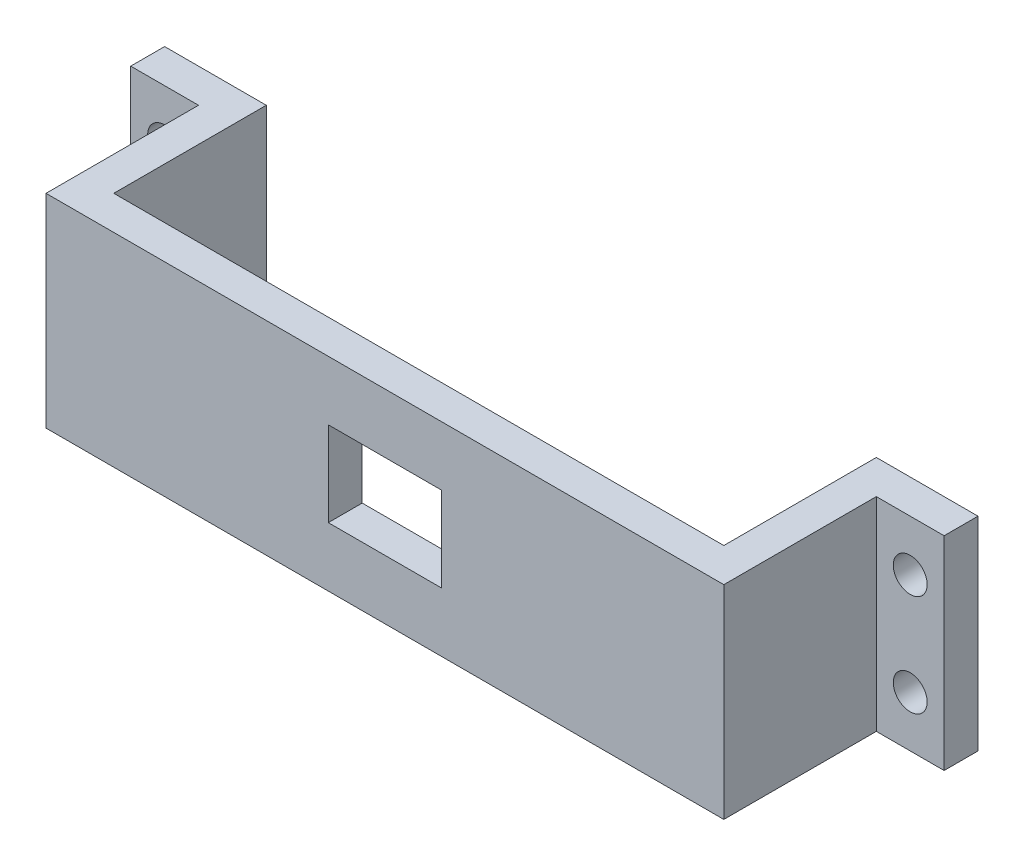
ISO-10303-21;
HEADER;
FILE_DESCRIPTION(('STEP AP214'),'2;1');
FILE_NAME('part.step','',(''),(''),'','','');
FILE_SCHEMA(('AUTOMOTIVE_DESIGN { 1 0 10303 214 1 1 1 1 }'));
ENDSEC;
DATA;
#1=APPLICATION_CONTEXT('core data for automotive mechanical design processes');
#2=APPLICATION_PROTOCOL_DEFINITION('international standard','automotive_design',2000,#1);
#3=PRODUCT_CONTEXT('',#1,'mechanical');
#4=PRODUCT('Part','Part','',(#3));
#5=PRODUCT_RELATED_PRODUCT_CATEGORY('part','',(#4));
#6=PRODUCT_DEFINITION_FORMATION('','',#4);
#7=PRODUCT_DEFINITION_CONTEXT('part definition',#1,'design');
#8=PRODUCT_DEFINITION('design','',#6,#7);
#9=PRODUCT_DEFINITION_SHAPE('','',#8);
#10=(LENGTH_UNIT() NAMED_UNIT(*) SI_UNIT(.MILLI.,.METRE.));
#11=(NAMED_UNIT(*) PLANE_ANGLE_UNIT() SI_UNIT($,.RADIAN.));
#12=(NAMED_UNIT(*) SI_UNIT($,.STERADIAN.) SOLID_ANGLE_UNIT());
#13=UNCERTAINTY_MEASURE_WITH_UNIT(LENGTH_MEASURE(1.E-05),#10,'distance_accuracy_value','');
#14=(GEOMETRIC_REPRESENTATION_CONTEXT(3) GLOBAL_UNCERTAINTY_ASSIGNED_CONTEXT((#13)) GLOBAL_UNIT_ASSIGNED_CONTEXT((#10,
#11,#12)) REPRESENTATION_CONTEXT('',''));
#15=CARTESIAN_POINT('',(0.,0.,0.));
#16=DIRECTION('',(0.,0.,1.));
#17=DIRECTION('',(1.,0.,0.));
#18=AXIS2_PLACEMENT_3D('',#15,#16,#17);
#19=CARTESIAN_POINT('',(0.,0.,6.35));
#20=DIRECTION('',(1.,0.,0.));
#21=DIRECTION('',(0.,0.,-1.));
#22=AXIS2_PLACEMENT_3D('',#19,#20,#21);
#23=PLANE('',#22);
#24=DIRECTION('',(0.,1.,0.));
#25=VECTOR('',#24,1.);
#26=CARTESIAN_POINT('',(0.,38.1,-22.225));
#27=LINE('',#26,#25);
#28=CARTESIAN_POINT('',(0.,0.,-22.225));
#29=VERTEX_POINT('',#28);
#30=CARTESIAN_POINT('',(0.,38.1,-22.225));
#31=VERTEX_POINT('',#30);
#32=EDGE_CURVE('E54',#29,#31,#27,.T.);
#33=ORIENTED_EDGE('',*,*,#32,.F.);
#34=DIRECTION('',(0.,0.,-1.));
#35=VECTOR('',#34,1.);
#36=CARTESIAN_POINT('',(0.,0.,6.35));
#37=LINE('',#36,#35);
#38=CARTESIAN_POINT('',(0.,0.,6.35));
#39=VERTEX_POINT('',#38);
#40=EDGE_CURVE('E11',#39,#29,#37,.T.);
#41=ORIENTED_EDGE('',*,*,#40,.F.);
#42=DIRECTION('',(0.,-1.,0.));
#43=VECTOR('',#42,1.);
#44=CARTESIAN_POINT('',(0.,0.,6.35));
#45=LINE('',#44,#43);
#46=CARTESIAN_POINT('',(0.,38.1,6.35));
#47=VERTEX_POINT('',#46);
#48=EDGE_CURVE('E300',#47,#39,#45,.T.);
#49=ORIENTED_EDGE('',*,*,#48,.F.);
#50=DIRECTION('',(0.,0.,-1.));
#51=VECTOR('',#50,1.);
#52=CARTESIAN_POINT('',(0.,38.1,6.35));
#53=LINE('',#52,#51);
#54=EDGE_CURVE('E314',#47,#31,#53,.T.);
#55=ORIENTED_EDGE('',*,*,#54,.T.);
#56=EDGE_LOOP('',(#33,#41,#49,#55));
#57=FACE_BOUND('',#56,.T.);
#58=ADVANCED_FACE('F39',(#57),#23,.F.);
#59=CARTESIAN_POINT('',(127.,0.,6.35));
#60=DIRECTION('',(-1.,0.,0.));
#61=DIRECTION('',(0.,0.,1.));
#62=AXIS2_PLACEMENT_3D('',#59,#60,#61);
#63=PLANE('',#62);
#64=DIRECTION('',(0.,-1.,0.));
#65=VECTOR('',#64,1.);
#66=CARTESIAN_POINT('',(127.,0.,-22.225));
#67=LINE('',#66,#65);
#68=CARTESIAN_POINT('',(127.,38.1,-22.225));
#69=VERTEX_POINT('',#68);
#70=CARTESIAN_POINT('',(127.,0.,-22.225));
#71=VERTEX_POINT('',#70);
#72=EDGE_CURVE('E61',#69,#71,#67,.T.);
#73=ORIENTED_EDGE('',*,*,#72,.F.);
#74=DIRECTION('',(0.,0.,-1.));
#75=VECTOR('',#74,1.);
#76=CARTESIAN_POINT('',(127.,38.1,6.35));
#77=LINE('',#76,#75);
#78=CARTESIAN_POINT('',(127.,38.1,6.35));
#79=VERTEX_POINT('',#78);
#80=EDGE_CURVE('E322',#79,#69,#77,.T.);
#81=ORIENTED_EDGE('',*,*,#80,.F.);
#82=DIRECTION('',(0.,1.,0.));
#83=VECTOR('',#82,1.);
#84=CARTESIAN_POINT('',(127.,0.,6.35));
#85=LINE('',#84,#83);
#86=CARTESIAN_POINT('',(127.,0.,6.35));
#87=VERTEX_POINT('',#86);
#88=EDGE_CURVE('E308',#87,#79,#85,.T.);
#89=ORIENTED_EDGE('',*,*,#88,.F.);
#90=DIRECTION('',(0.,0.,-1.));
#91=VECTOR('',#90,1.);
#92=CARTESIAN_POINT('',(127.,0.,6.35));
#93=LINE('',#92,#91);
#94=EDGE_CURVE('E47',#87,#71,#93,.T.);
#95=ORIENTED_EDGE('',*,*,#94,.T.);
#96=EDGE_LOOP('',(#73,#81,#89,#95));
#97=FACE_BOUND('',#96,.T.);
#98=ADVANCED_FACE('F327',(#97),#63,.F.);
#99=CARTESIAN_POINT('',(0.,0.,0.));
#100=DIRECTION('',(0.,0.,-1.));
#101=DIRECTION('',(-1.,0.,0.));
#102=AXIS2_PLACEMENT_3D('',#99,#100,#101);
#103=PLANE('',#102);
#104=DIRECTION('',(-1.,0.,0.));
#105=VECTOR('',#104,1.);
#106=CARTESIAN_POINT('',(52.8955,26.99004,0.));
#107=LINE('',#106,#105);
#108=CARTESIAN_POINT('',(74.1045,26.99004,0.));
#109=VERTEX_POINT('',#108);
#110=CARTESIAN_POINT('',(52.8955,26.99004,0.));
#111=VERTEX_POINT('',#110);
#112=EDGE_CURVE('E261',#109,#111,#107,.T.);
#113=ORIENTED_EDGE('',*,*,#112,.T.);
#114=DIRECTION('',(0.,-1.,0.));
#115=VECTOR('',#114,1.);
#116=CARTESIAN_POINT('',(52.8955,11.10996,0.));
#117=LINE('',#116,#115);
#118=CARTESIAN_POINT('',(52.8955,11.10996,0.));
#119=VERTEX_POINT('',#118);
#120=EDGE_CURVE('E256',#111,#119,#117,.T.);
#121=ORIENTED_EDGE('',*,*,#120,.T.);
#122=DIRECTION('',(1.,0.,0.));
#123=VECTOR('',#122,1.);
#124=CARTESIAN_POINT('',(52.8955,11.10996,0.));
#125=LINE('',#124,#123);
#126=CARTESIAN_POINT('',(74.1045,11.10996,0.));
#127=VERTEX_POINT('',#126);
#128=EDGE_CURVE('E275',#119,#127,#125,.T.);
#129=ORIENTED_EDGE('',*,*,#128,.T.);
#130=DIRECTION('',(0.,1.,0.));
#131=VECTOR('',#130,1.);
#132=CARTESIAN_POINT('',(74.1045,11.10996,0.));
#133=LINE('',#132,#131);
#134=EDGE_CURVE('E279',#127,#109,#133,.T.);
#135=ORIENTED_EDGE('',*,*,#134,.T.);
#136=EDGE_LOOP('',(#113,#121,#129,#135));
#137=FACE_BOUND('',#136,.T.);
#138=DIRECTION('',(-1.,0.,0.));
#139=VECTOR('',#138,1.);
#140=CARTESIAN_POINT('',(0.,38.1,0.));
#141=LINE('',#140,#139);
#142=CARTESIAN_POINT('',(120.65,38.1,0.));
#143=VERTEX_POINT('',#142);
#144=CARTESIAN_POINT('',(6.35,38.1,0.));
#145=VERTEX_POINT('',#144);
#146=EDGE_CURVE('E305',#143,#145,#141,.T.);
#147=ORIENTED_EDGE('',*,*,#146,.F.);
#148=DIRECTION('',(0.,1.,0.));
#149=VECTOR('',#148,1.);
#150=CARTESIAN_POINT('',(120.65,0.,0.));
#151=LINE('',#150,#149);
#152=CARTESIAN_POINT('',(120.65,0.,0.));
#153=VERTEX_POINT('',#152);
#154=EDGE_CURVE('E222',#153,#143,#151,.T.);
#155=ORIENTED_EDGE('',*,*,#154,.F.);
#156=DIRECTION('',(1.,0.,0.));
#157=VECTOR('',#156,1.);
#158=CARTESIAN_POINT('',(0.,0.,0.));
#159=LINE('',#158,#157);
#160=CARTESIAN_POINT('',(6.35,0.,0.));
#161=VERTEX_POINT('',#160);
#162=EDGE_CURVE('E299',#161,#153,#159,.T.);
#163=ORIENTED_EDGE('',*,*,#162,.F.);
#164=DIRECTION('',(0.,-1.,0.));
#165=VECTOR('',#164,1.);
#166=CARTESIAN_POINT('',(6.35,0.,0.));
#167=LINE('',#166,#165);
#168=EDGE_CURVE('E241',#145,#161,#167,.T.);
#169=ORIENTED_EDGE('',*,*,#168,.F.);
#170=EDGE_LOOP('',(#147,#155,#163,#169));
#171=FACE_BOUND('',#170,.T.);
#172=ADVANCED_FACE('F362',(#137,#171),#103,.T.);
#173=CARTESIAN_POINT('',(0.,0.,6.35));
#174=DIRECTION('',(0.,0.,-1.));
#175=DIRECTION('',(-1.,0.,0.));
#176=AXIS2_PLACEMENT_3D('',#173,#174,#175);
#177=PLANE('',#176);
#178=ORIENTED_EDGE('',*,*,#48,.T.);
#179=DIRECTION('',(1.,0.,0.));
#180=VECTOR('',#179,1.);
#181=CARTESIAN_POINT('',(0.,0.,6.35));
#182=LINE('',#181,#180);
#183=EDGE_CURVE('E304',#39,#87,#182,.T.);
#184=ORIENTED_EDGE('',*,*,#183,.T.);
#185=ORIENTED_EDGE('',*,*,#88,.T.);
#186=DIRECTION('',(-1.,0.,0.));
#187=VECTOR('',#186,1.);
#188=CARTESIAN_POINT('',(0.,38.1,6.35));
#189=LINE('',#188,#187);
#190=EDGE_CURVE('E311',#79,#47,#189,.T.);
#191=ORIENTED_EDGE('',*,*,#190,.T.);
#192=EDGE_LOOP('',(#178,#184,#185,#191));
#193=FACE_BOUND('',#192,.T.);
#194=DIRECTION('',(0.,-1.,0.));
#195=VECTOR('',#194,1.);
#196=CARTESIAN_POINT('',(52.8955,11.10996,6.35));
#197=LINE('',#196,#195);
#198=CARTESIAN_POINT('',(52.8955,26.99004,6.35));
#199=VERTEX_POINT('',#198);
#200=CARTESIAN_POINT('',(52.8955,11.10996,6.35));
#201=VERTEX_POINT('',#200);
#202=EDGE_CURVE('E257',#199,#201,#197,.T.);
#203=ORIENTED_EDGE('',*,*,#202,.F.);
#204=DIRECTION('',(-1.,0.,0.));
#205=VECTOR('',#204,1.);
#206=CARTESIAN_POINT('',(52.8955,26.99004,6.35));
#207=LINE('',#206,#205);
#208=CARTESIAN_POINT('',(74.1045,26.99004,6.35));
#209=VERTEX_POINT('',#208);
#210=EDGE_CURVE('E268',#209,#199,#207,.T.);
#211=ORIENTED_EDGE('',*,*,#210,.F.);
#212=DIRECTION('',(0.,1.,0.));
#213=VECTOR('',#212,1.);
#214=CARTESIAN_POINT('',(74.1045,11.10996,6.35));
#215=LINE('',#214,#213);
#216=CARTESIAN_POINT('',(74.1045,11.10996,6.35));
#217=VERTEX_POINT('',#216);
#218=EDGE_CURVE('E264',#217,#209,#215,.T.);
#219=ORIENTED_EDGE('',*,*,#218,.F.);
#220=DIRECTION('',(1.,0.,0.));
#221=VECTOR('',#220,1.);
#222=CARTESIAN_POINT('',(52.8955,11.10996,6.35));
#223=LINE('',#222,#221);
#224=EDGE_CURVE('E260',#201,#217,#223,.T.);
#225=ORIENTED_EDGE('',*,*,#224,.F.);
#226=EDGE_LOOP('',(#203,#211,#219,#225));
#227=FACE_BOUND('',#226,.T.);
#228=ADVANCED_FACE('F350',(#193,#227),#177,.F.);
#229=CARTESIAN_POINT('',(0.,0.,6.35));
#230=DIRECTION('',(0.,1.,0.));
#231=DIRECTION('',(0.,0.,1.));
#232=AXIS2_PLACEMENT_3D('',#229,#230,#231);
#233=PLANE('',#232);
#234=ORIENTED_EDGE('',*,*,#40,.T.);
#235=DIRECTION('',(1.,0.,0.));
#236=VECTOR('',#235,1.);
#237=CARTESIAN_POINT('',(-12.7,0.,-22.225));
#238=LINE('',#237,#236);
#239=CARTESIAN_POINT('',(-12.7,0.,-22.225));
#240=VERTEX_POINT('',#239);
#241=EDGE_CURVE('E170',#240,#29,#238,.T.);
#242=ORIENTED_EDGE('',*,*,#241,.F.);
#243=DIRECTION('',(0.,0.,1.));
#244=VECTOR('',#243,1.);
#245=CARTESIAN_POINT('',(-12.7,0.,-28.575));
#246=LINE('',#245,#244);
#247=CARTESIAN_POINT('',(-12.7,0.,-28.575));
#248=VERTEX_POINT('',#247);
#249=EDGE_CURVE('E167',#248,#240,#246,.T.);
#250=ORIENTED_EDGE('',*,*,#249,.F.);
#251=DIRECTION('',(-1.,0.,0.));
#252=VECTOR('',#251,1.);
#253=CARTESIAN_POINT('',(0.,0.,-28.575));
#254=LINE('',#253,#252);
#255=CARTESIAN_POINT('',(6.35,0.,-28.575));
#256=VERTEX_POINT('',#255);
#257=EDGE_CURVE('E153',#256,#248,#254,.T.);
#258=ORIENTED_EDGE('',*,*,#257,.F.);
#259=DIRECTION('',(0.,0.,1.));
#260=VECTOR('',#259,1.);
#261=CARTESIAN_POINT('',(6.35,0.,-28.575));
#262=LINE('',#261,#260);
#263=EDGE_CURVE('E164',#256,#161,#262,.T.);
#264=ORIENTED_EDGE('',*,*,#263,.T.);
#265=ORIENTED_EDGE('',*,*,#162,.T.);
#266=DIRECTION('',(0.,0.,1.));
#267=VECTOR('',#266,1.);
#268=CARTESIAN_POINT('',(120.65,0.,-28.575));
#269=LINE('',#268,#267);
#270=CARTESIAN_POINT('',(120.65,0.,-28.575));
#271=VERTEX_POINT('',#270);
#272=EDGE_CURVE('E238',#271,#153,#269,.T.);
#273=ORIENTED_EDGE('',*,*,#272,.F.);
#274=DIRECTION('',(-1.,0.,0.));
#275=VECTOR('',#274,1.);
#276=CARTESIAN_POINT('',(127.,0.,-28.575));
#277=LINE('',#276,#275);
#278=CARTESIAN_POINT('',(139.7,0.,-28.575));
#279=VERTEX_POINT('',#278);
#280=EDGE_CURVE('E223',#279,#271,#277,.T.);
#281=ORIENTED_EDGE('',*,*,#280,.F.);
#282=DIRECTION('',(0.,0.,-1.));
#283=VECTOR('',#282,1.);
#284=CARTESIAN_POINT('',(139.7,0.,-28.575));
#285=LINE('',#284,#283);
#286=CARTESIAN_POINT('',(139.7,0.,-22.225));
#287=VERTEX_POINT('',#286);
#288=EDGE_CURVE('E208',#287,#279,#285,.T.);
#289=ORIENTED_EDGE('',*,*,#288,.F.);
#290=DIRECTION('',(-1.,0.,0.));
#291=VECTOR('',#290,1.);
#292=CARTESIAN_POINT('',(139.7,0.,-22.225));
#293=LINE('',#292,#291);
#294=EDGE_CURVE('E212',#287,#71,#293,.T.);
#295=ORIENTED_EDGE('',*,*,#294,.T.);
#296=ORIENTED_EDGE('',*,*,#94,.F.);
#297=ORIENTED_EDGE('',*,*,#183,.F.);
#298=EDGE_LOOP('',(#234,#242,#250,#258,#264,#265,#273,#281,#289,#295,#296,#297));
#299=FACE_BOUND('',#298,.T.);
#300=ADVANCED_FACE('F168',(#299),#233,.F.);
#301=CARTESIAN_POINT('',(0.,38.1,6.35));
#302=DIRECTION('',(0.,-1.,0.));
#303=DIRECTION('',(0.,0.,-1.));
#304=AXIS2_PLACEMENT_3D('',#301,#302,#303);
#305=PLANE('',#304);
#306=ORIENTED_EDGE('',*,*,#80,.T.);
#307=DIRECTION('',(-1.,0.,0.));
#308=VECTOR('',#307,1.);
#309=CARTESIAN_POINT('',(139.7,38.1,-22.225));
#310=LINE('',#309,#308);
#311=CARTESIAN_POINT('',(139.7,38.1,-22.225));
#312=VERTEX_POINT('',#311);
#313=EDGE_CURVE('E218',#312,#69,#310,.T.);
#314=ORIENTED_EDGE('',*,*,#313,.F.);
#315=DIRECTION('',(0.,0.,1.));
#316=VECTOR('',#315,1.);
#317=CARTESIAN_POINT('',(139.7,38.1,-28.575));
#318=LINE('',#317,#316);
#319=CARTESIAN_POINT('',(139.7,38.1,-28.575));
#320=VERTEX_POINT('',#319);
#321=EDGE_CURVE('E202',#320,#312,#318,.T.);
#322=ORIENTED_EDGE('',*,*,#321,.F.);
#323=DIRECTION('',(1.,0.,0.));
#324=VECTOR('',#323,1.);
#325=CARTESIAN_POINT('',(127.,38.1,-28.575));
#326=LINE('',#325,#324);
#327=CARTESIAN_POINT('',(120.65,38.1,-28.575));
#328=VERTEX_POINT('',#327);
#329=EDGE_CURVE('E229',#328,#320,#326,.T.);
#330=ORIENTED_EDGE('',*,*,#329,.F.);
#331=DIRECTION('',(0.,0.,1.));
#332=VECTOR('',#331,1.);
#333=CARTESIAN_POINT('',(120.65,38.1,-28.575));
#334=LINE('',#333,#332);
#335=EDGE_CURVE('E232',#328,#143,#334,.T.);
#336=ORIENTED_EDGE('',*,*,#335,.T.);
#337=ORIENTED_EDGE('',*,*,#146,.T.);
#338=DIRECTION('',(0.,0.,1.));
#339=VECTOR('',#338,1.);
#340=CARTESIAN_POINT('',(6.34999999999999,38.1,-28.575));
#341=LINE('',#340,#339);
#342=CARTESIAN_POINT('',(6.34999999999999,38.1,-28.575));
#343=VERTEX_POINT('',#342);
#344=EDGE_CURVE('E252',#343,#145,#341,.T.);
#345=ORIENTED_EDGE('',*,*,#344,.F.);
#346=DIRECTION('',(1.,0.,0.));
#347=VECTOR('',#346,1.);
#348=CARTESIAN_POINT('',(0.,38.1,-28.575));
#349=LINE('',#348,#347);
#350=CARTESIAN_POINT('',(-12.7,38.1,-28.575));
#351=VERTEX_POINT('',#350);
#352=EDGE_CURVE('E242',#351,#343,#349,.T.);
#353=ORIENTED_EDGE('',*,*,#352,.F.);
#354=DIRECTION('',(0.,0.,-1.));
#355=VECTOR('',#354,1.);
#356=CARTESIAN_POINT('',(-12.7,38.1,-28.575));
#357=LINE('',#356,#355);
#358=CARTESIAN_POINT('',(-12.7,38.1,-22.225));
#359=VERTEX_POINT('',#358);
#360=EDGE_CURVE('E179',#359,#351,#357,.T.);
#361=ORIENTED_EDGE('',*,*,#360,.F.);
#362=DIRECTION('',(1.,0.,0.));
#363=VECTOR('',#362,1.);
#364=CARTESIAN_POINT('',(-12.7,38.1,-22.225));
#365=LINE('',#364,#363);
#366=EDGE_CURVE('E191',#359,#31,#365,.T.);
#367=ORIENTED_EDGE('',*,*,#366,.T.);
#368=ORIENTED_EDGE('',*,*,#54,.F.);
#369=ORIENTED_EDGE('',*,*,#190,.F.);
#370=EDGE_LOOP('',(#306,#314,#322,#330,#336,#337,#345,#353,#361,#367,#368,#369));
#371=FACE_BOUND('',#370,.T.);
#372=ADVANCED_FACE('F345',(#371),#305,.F.);
#373=CARTESIAN_POINT('',(52.8955,11.10996,6.35));
#374=DIRECTION('',(1.,0.,0.));
#375=DIRECTION('',(0.,0.,-1.));
#376=AXIS2_PLACEMENT_3D('',#373,#374,#375);
#377=PLANE('',#376);
#378=ORIENTED_EDGE('',*,*,#120,.F.);
#379=DIRECTION('',(0.,0.,-1.));
#380=VECTOR('',#379,1.);
#381=CARTESIAN_POINT('',(52.8955,26.99004,6.35));
#382=LINE('',#381,#380);
#383=EDGE_CURVE('E271',#199,#111,#382,.T.);
#384=ORIENTED_EDGE('',*,*,#383,.F.);
#385=ORIENTED_EDGE('',*,*,#202,.T.);
#386=DIRECTION('',(0.,0.,-1.));
#387=VECTOR('',#386,1.);
#388=CARTESIAN_POINT('',(52.8955,11.10996,6.35));
#389=LINE('',#388,#387);
#390=EDGE_CURVE('E295',#201,#119,#389,.T.);
#391=ORIENTED_EDGE('',*,*,#390,.T.);
#392=EDGE_LOOP('',(#378,#384,#385,#391));
#393=FACE_BOUND('',#392,.T.);
#394=ADVANCED_FACE('F391',(#393),#377,.T.);
#395=CARTESIAN_POINT('',(52.8955,11.10996,6.35));
#396=DIRECTION('',(0.,1.,0.));
#397=DIRECTION('',(0.,0.,1.));
#398=AXIS2_PLACEMENT_3D('',#395,#396,#397);
#399=PLANE('',#398);
#400=ORIENTED_EDGE('',*,*,#128,.F.);
#401=ORIENTED_EDGE('',*,*,#390,.F.);
#402=ORIENTED_EDGE('',*,*,#224,.T.);
#403=DIRECTION('',(0.,0.,-1.));
#404=VECTOR('',#403,1.);
#405=CARTESIAN_POINT('',(74.1045,11.10996,6.35));
#406=LINE('',#405,#404);
#407=EDGE_CURVE('E292',#217,#127,#406,.T.);
#408=ORIENTED_EDGE('',*,*,#407,.T.);
#409=EDGE_LOOP('',(#400,#401,#402,#408));
#410=FACE_BOUND('',#409,.T.);
#411=ADVANCED_FACE('F398',(#410),#399,.T.);
#412=CARTESIAN_POINT('',(74.1045,11.10996,6.35));
#413=DIRECTION('',(-1.,0.,0.));
#414=DIRECTION('',(0.,0.,1.));
#415=AXIS2_PLACEMENT_3D('',#412,#413,#414);
#416=PLANE('',#415);
#417=ORIENTED_EDGE('',*,*,#134,.F.);
#418=ORIENTED_EDGE('',*,*,#407,.F.);
#419=ORIENTED_EDGE('',*,*,#218,.T.);
#420=DIRECTION('',(0.,0.,-1.));
#421=VECTOR('',#420,1.);
#422=CARTESIAN_POINT('',(74.1045,26.99004,6.35));
#423=LINE('',#422,#421);
#424=EDGE_CURVE('E289',#209,#109,#423,.T.);
#425=ORIENTED_EDGE('',*,*,#424,.T.);
#426=EDGE_LOOP('',(#417,#418,#419,#425));
#427=FACE_BOUND('',#426,.T.);
#428=ADVANCED_FACE('F402',(#427),#416,.T.);
#429=CARTESIAN_POINT('',(52.8955,26.99004,6.35));
#430=DIRECTION('',(0.,-1.,0.));
#431=DIRECTION('',(0.,0.,-1.));
#432=AXIS2_PLACEMENT_3D('',#429,#430,#431);
#433=PLANE('',#432);
#434=ORIENTED_EDGE('',*,*,#112,.F.);
#435=ORIENTED_EDGE('',*,*,#424,.F.);
#436=ORIENTED_EDGE('',*,*,#210,.T.);
#437=ORIENTED_EDGE('',*,*,#383,.T.);
#438=EDGE_LOOP('',(#434,#435,#436,#437));
#439=FACE_BOUND('',#438,.T.);
#440=ADVANCED_FACE('F406',(#439),#433,.T.);
#441=CARTESIAN_POINT('',(6.35,0.,-28.575));
#442=DIRECTION('',(-1.,0.,0.));
#443=DIRECTION('',(0.,-1.,0.));
#444=AXIS2_PLACEMENT_3D('',#441,#442,#443);
#445=PLANE('',#444);
#446=ORIENTED_EDGE('',*,*,#168,.T.);
#447=ORIENTED_EDGE('',*,*,#263,.F.);
#448=DIRECTION('',(0.,-1.,0.));
#449=VECTOR('',#448,1.);
#450=CARTESIAN_POINT('',(6.35,0.,-28.575));
#451=LINE('',#450,#449);
#452=EDGE_CURVE('E159',#343,#256,#451,.T.);
#453=ORIENTED_EDGE('',*,*,#452,.F.);
#454=ORIENTED_EDGE('',*,*,#344,.T.);
#455=EDGE_LOOP('',(#446,#447,#453,#454));
#456=FACE_BOUND('',#455,.T.);
#457=ADVANCED_FACE('F359',(#456),#445,.F.);
#458=CARTESIAN_POINT('',(0.,0.,-28.575));
#459=DIRECTION('',(0.,0.,-1.));
#460=DIRECTION('',(-1.,0.,0.));
#461=AXIS2_PLACEMENT_3D('',#458,#459,#460);
#462=PLANE('',#461);
#463=CARTESIAN_POINT('',(-6.35,28.575,-28.575));
#464=DIRECTION('',(0.,0.,-1.));
#465=DIRECTION('',(-1.,0.,0.));
#466=AXIS2_PLACEMENT_3D('',#463,#464,#465);
#467=CIRCLE('',#466,3.175);
#468=CARTESIAN_POINT('',(-3.175,28.575,-28.575));
#469=VERTEX_POINT('',#468);
#470=EDGE_CURVE('E614',#469,#469,#467,.F.);
#471=ORIENTED_EDGE('',*,*,#470,.T.);
#472=EDGE_LOOP('',(#471));
#473=FACE_BOUND('',#472,.T.);
#474=CARTESIAN_POINT('',(-6.35,9.525,-28.575));
#475=DIRECTION('',(0.,0.,-1.));
#476=DIRECTION('',(-1.,0.,0.));
#477=AXIS2_PLACEMENT_3D('',#474,#475,#476);
#478=CIRCLE('',#477,3.175);
#479=CARTESIAN_POINT('',(-3.175,9.525,-28.575));
#480=VERTEX_POINT('',#479);
#481=EDGE_CURVE('E621',#480,#480,#478,.F.);
#482=ORIENTED_EDGE('',*,*,#481,.T.);
#483=EDGE_LOOP('',(#482));
#484=FACE_BOUND('',#483,.T.);
#485=ORIENTED_EDGE('',*,*,#257,.T.);
#486=DIRECTION('',(0.,-1.,0.));
#487=VECTOR('',#486,1.);
#488=CARTESIAN_POINT('',(-12.7,38.1,-28.575));
#489=LINE('',#488,#487);
#490=EDGE_CURVE('E157',#351,#248,#489,.T.);
#491=ORIENTED_EDGE('',*,*,#490,.F.);
#492=ORIENTED_EDGE('',*,*,#352,.T.);
#493=ORIENTED_EDGE('',*,*,#452,.T.);
#494=EDGE_LOOP('',(#485,#491,#492,#493));
#495=FACE_BOUND('',#494,.T.);
#496=ADVANCED_FACE('F155',(#473,#484,#495),#462,.T.);
#497=CARTESIAN_POINT('',(120.65,0.,-28.575));
#498=DIRECTION('',(1.,0.,0.));
#499=DIRECTION('',(0.,0.,-1.));
#500=AXIS2_PLACEMENT_3D('',#497,#498,#499);
#501=PLANE('',#500);
#502=ORIENTED_EDGE('',*,*,#154,.T.);
#503=ORIENTED_EDGE('',*,*,#335,.F.);
#504=DIRECTION('',(0.,1.,0.));
#505=VECTOR('',#504,1.);
#506=CARTESIAN_POINT('',(120.65,0.,-28.575));
#507=LINE('',#506,#505);
#508=EDGE_CURVE('E226',#271,#328,#507,.T.);
#509=ORIENTED_EDGE('',*,*,#508,.F.);
#510=ORIENTED_EDGE('',*,*,#272,.T.);
#511=EDGE_LOOP('',(#502,#503,#509,#510));
#512=FACE_BOUND('',#511,.T.);
#513=ADVANCED_FACE('F364',(#512),#501,.F.);
#514=CARTESIAN_POINT('',(0.,0.,-28.575));
#515=DIRECTION('',(0.,0.,1.));
#516=DIRECTION('',(1.,0.,0.));
#517=AXIS2_PLACEMENT_3D('',#514,#515,#516);
#518=PLANE('',#517);
#519=CARTESIAN_POINT('',(133.35,9.525,-28.575));
#520=DIRECTION('',(0.,0.,1.));
#521=DIRECTION('',(1.,0.,0.));
#522=AXIS2_PLACEMENT_3D('',#519,#520,#521);
#523=CIRCLE('',#522,3.175);
#524=CARTESIAN_POINT('',(136.525,9.525,-28.575));
#525=VERTEX_POINT('',#524);
#526=EDGE_CURVE('E600',#525,#525,#523,.F.);
#527=ORIENTED_EDGE('',*,*,#526,.F.);
#528=EDGE_LOOP('',(#527));
#529=FACE_BOUND('',#528,.T.);
#530=CARTESIAN_POINT('',(133.35,28.575,-28.575));
#531=DIRECTION('',(0.,0.,1.));
#532=DIRECTION('',(1.,0.,0.));
#533=AXIS2_PLACEMENT_3D('',#530,#531,#532);
#534=CIRCLE('',#533,3.175);
#535=CARTESIAN_POINT('',(136.525,28.575,-28.575));
#536=VERTEX_POINT('',#535);
#537=EDGE_CURVE('E183',#536,#536,#534,.F.);
#538=ORIENTED_EDGE('',*,*,#537,.F.);
#539=EDGE_LOOP('',(#538));
#540=FACE_BOUND('',#539,.T.);
#541=ORIENTED_EDGE('',*,*,#329,.T.);
#542=DIRECTION('',(0.,1.,0.));
#543=VECTOR('',#542,1.);
#544=CARTESIAN_POINT('',(139.7,0.,-28.575));
#545=LINE('',#544,#543);
#546=EDGE_CURVE('E198',#279,#320,#545,.T.);
#547=ORIENTED_EDGE('',*,*,#546,.F.);
#548=ORIENTED_EDGE('',*,*,#280,.T.);
#549=ORIENTED_EDGE('',*,*,#508,.T.);
#550=EDGE_LOOP('',(#541,#547,#548,#549));
#551=FACE_BOUND('',#550,.T.);
#552=ADVANCED_FACE('F339',(#529,#540,#551),#518,.F.);
#553=CARTESIAN_POINT('',(139.7,0.,-22.225));
#554=DIRECTION('',(0.,0.,-1.));
#555=DIRECTION('',(-1.,0.,0.));
#556=AXIS2_PLACEMENT_3D('',#553,#554,#555);
#557=PLANE('',#556);
#558=CARTESIAN_POINT('',(133.35,9.525,-22.225));
#559=DIRECTION('',(0.,0.,1.));
#560=DIRECTION('',(1.,0.,0.));
#561=AXIS2_PLACEMENT_3D('',#558,#559,#560);
#562=CIRCLE('',#561,3.175);
#563=CARTESIAN_POINT('',(136.525,9.525,-22.225));
#564=VERTEX_POINT('',#563);
#565=EDGE_CURVE('E597',#564,#564,#562,.T.);
#566=ORIENTED_EDGE('',*,*,#565,.F.);
#567=EDGE_LOOP('',(#566));
#568=FACE_BOUND('',#567,.T.);
#569=CARTESIAN_POINT('',(133.35,28.575,-22.225));
#570=DIRECTION('',(0.,0.,1.));
#571=DIRECTION('',(1.,0.,0.));
#572=AXIS2_PLACEMENT_3D('',#569,#570,#571);
#573=CIRCLE('',#572,3.175);
#574=CARTESIAN_POINT('',(136.525,28.575,-22.225));
#575=VERTEX_POINT('',#574);
#576=EDGE_CURVE('E602',#575,#575,#573,.T.);
#577=ORIENTED_EDGE('',*,*,#576,.F.);
#578=EDGE_LOOP('',(#577));
#579=FACE_BOUND('',#578,.T.);
#580=ORIENTED_EDGE('',*,*,#72,.T.);
#581=ORIENTED_EDGE('',*,*,#294,.F.);
#582=DIRECTION('',(0.,-1.,0.));
#583=VECTOR('',#582,1.);
#584=CARTESIAN_POINT('',(139.7,0.,-22.225));
#585=LINE('',#584,#583);
#586=EDGE_CURVE('E205',#312,#287,#585,.T.);
#587=ORIENTED_EDGE('',*,*,#586,.F.);
#588=ORIENTED_EDGE('',*,*,#313,.T.);
#589=EDGE_LOOP('',(#580,#581,#587,#588));
#590=FACE_BOUND('',#589,.T.);
#591=ADVANCED_FACE('F330',(#568,#579,#590),#557,.F.);
#592=CARTESIAN_POINT('',(139.7,0.,0.));
#593=DIRECTION('',(1.,0.,0.));
#594=DIRECTION('',(0.,0.,-1.));
#595=AXIS2_PLACEMENT_3D('',#592,#593,#594);
#596=PLANE('',#595);
#597=ORIENTED_EDGE('',*,*,#546,.T.);
#598=ORIENTED_EDGE('',*,*,#321,.T.);
#599=ORIENTED_EDGE('',*,*,#586,.T.);
#600=ORIENTED_EDGE('',*,*,#288,.T.);
#601=EDGE_LOOP('',(#597,#598,#599,#600));
#602=FACE_BOUND('',#601,.T.);
#603=ADVANCED_FACE('F337',(#602),#596,.T.);
#604=CARTESIAN_POINT('',(-12.7,38.1,-22.225));
#605=DIRECTION('',(0.,0.,-1.));
#606=DIRECTION('',(-1.,0.,0.));
#607=AXIS2_PLACEMENT_3D('',#604,#605,#606);
#608=PLANE('',#607);
#609=CARTESIAN_POINT('',(-6.35,28.575,-22.225));
#610=DIRECTION('',(0.,0.,1.));
#611=DIRECTION('',(1.,0.,0.));
#612=AXIS2_PLACEMENT_3D('',#609,#610,#611);
#613=CIRCLE('',#612,3.175);
#614=CARTESIAN_POINT('',(-3.175,28.575,-22.225));
#615=VERTEX_POINT('',#614);
#616=EDGE_CURVE('E607',#615,#615,#613,.T.);
#617=ORIENTED_EDGE('',*,*,#616,.F.);
#618=EDGE_LOOP('',(#617));
#619=FACE_BOUND('',#618,.T.);
#620=CARTESIAN_POINT('',(-6.35,9.525,-22.225));
#621=DIRECTION('',(0.,0.,1.));
#622=DIRECTION('',(1.,0.,0.));
#623=AXIS2_PLACEMENT_3D('',#620,#621,#622);
#624=CIRCLE('',#623,3.175);
#625=CARTESIAN_POINT('',(-3.175,9.525,-22.225));
#626=VERTEX_POINT('',#625);
#627=EDGE_CURVE('E617',#626,#626,#624,.T.);
#628=ORIENTED_EDGE('',*,*,#627,.F.);
#629=EDGE_LOOP('',(#628));
#630=FACE_BOUND('',#629,.T.);
#631=ORIENTED_EDGE('',*,*,#32,.T.);
#632=ORIENTED_EDGE('',*,*,#366,.F.);
#633=DIRECTION('',(0.,1.,0.));
#634=VECTOR('',#633,1.);
#635=CARTESIAN_POINT('',(-12.7,38.1,-22.225));
#636=LINE('',#635,#634);
#637=EDGE_CURVE('E174',#240,#359,#636,.T.);
#638=ORIENTED_EDGE('',*,*,#637,.F.);
#639=ORIENTED_EDGE('',*,*,#241,.T.);
#640=EDGE_LOOP('',(#631,#632,#638,#639));
#641=FACE_BOUND('',#640,.T.);
#642=ADVANCED_FACE('F353',(#619,#630,#641),#608,.F.);
#643=CARTESIAN_POINT('',(-12.7,0.,0.));
#644=DIRECTION('',(-1.,0.,0.));
#645=DIRECTION('',(0.,0.,1.));
#646=AXIS2_PLACEMENT_3D('',#643,#644,#645);
#647=PLANE('',#646);
#648=ORIENTED_EDGE('',*,*,#490,.T.);
#649=ORIENTED_EDGE('',*,*,#249,.T.);
#650=ORIENTED_EDGE('',*,*,#637,.T.);
#651=ORIENTED_EDGE('',*,*,#360,.T.);
#652=EDGE_LOOP('',(#648,#649,#650,#651));
#653=FACE_BOUND('',#652,.T.);
#654=ADVANCED_FACE('F177',(#653),#647,.T.);
#655=CARTESIAN_POINT('',(-6.35,9.525,-28.576));
#656=DIRECTION('',(0.,0.,1.));
#657=DIRECTION('',(1.,0.,0.));
#658=AXIS2_PLACEMENT_3D('',#655,#656,#657);
#659=CYLINDRICAL_SURFACE('',#658,3.175);
#660=CARTESIAN_POINT('',(-3.175,9.525,-28.575));
#661=CARTESIAN_POINT('',(-3.175,9.525,-28.5088541666667));
#662=CARTESIAN_POINT('',(-3.175,9.525,-28.4427083333333));
#663=CARTESIAN_POINT('',(-3.175,9.525,-28.3104166666667));
#664=CARTESIAN_POINT('',(-3.175,9.525,-28.2442708333333));
#665=CARTESIAN_POINT('',(-3.175,9.525,-28.1119791666667));
#666=CARTESIAN_POINT('',(-3.175,9.525,-28.0458333333333));
#667=CARTESIAN_POINT('',(-3.175,9.525,-27.9135416666667));
#668=CARTESIAN_POINT('',(-3.175,9.525,-27.8473958333333));
#669=CARTESIAN_POINT('',(-3.175,9.525,-27.7151041666667));
#670=CARTESIAN_POINT('',(-3.175,9.525,-27.6489583333333));
#671=CARTESIAN_POINT('',(-3.175,9.525,-27.5166666666667));
#672=CARTESIAN_POINT('',(-3.175,9.525,-27.4505208333333));
#673=CARTESIAN_POINT('',(-3.175,9.525,-27.3182291666667));
#674=CARTESIAN_POINT('',(-3.175,9.525,-27.2520833333333));
#675=CARTESIAN_POINT('',(-3.175,9.525,-27.1197916666667));
#676=CARTESIAN_POINT('',(-3.175,9.525,-27.0536458333333));
#677=CARTESIAN_POINT('',(-3.175,9.525,-26.9213541666667));
#678=CARTESIAN_POINT('',(-3.175,9.525,-26.8552083333333));
#679=CARTESIAN_POINT('',(-3.175,9.525,-26.7229166666667));
#680=CARTESIAN_POINT('',(-3.175,9.525,-26.6567708333333));
#681=CARTESIAN_POINT('',(-3.175,9.525,-26.5244791666667));
#682=CARTESIAN_POINT('',(-3.175,9.525,-26.4583333333333));
#683=CARTESIAN_POINT('',(-3.175,9.525,-26.3260416666667));
#684=CARTESIAN_POINT('',(-3.175,9.525,-26.2598958333333));
#685=CARTESIAN_POINT('',(-3.175,9.525,-26.1276041666667));
#686=CARTESIAN_POINT('',(-3.175,9.525,-26.0614583333333));
#687=CARTESIAN_POINT('',(-3.175,9.525,-25.9291666666667));
#688=CARTESIAN_POINT('',(-3.175,9.525,-25.8630208333333));
#689=CARTESIAN_POINT('',(-3.175,9.525,-25.7307291666667));
#690=CARTESIAN_POINT('',(-3.175,9.525,-25.6645833333333));
#691=CARTESIAN_POINT('',(-3.175,9.525,-25.5322916666667));
#692=CARTESIAN_POINT('',(-3.175,9.525,-25.4661458333333));
#693=CARTESIAN_POINT('',(-3.175,9.525,-25.3338541666667));
#694=CARTESIAN_POINT('',(-3.175,9.525,-25.2677083333333));
#695=CARTESIAN_POINT('',(-3.175,9.525,-25.1354166666667));
#696=CARTESIAN_POINT('',(-3.175,9.525,-25.0692708333333));
#697=CARTESIAN_POINT('',(-3.175,9.525,-24.9369791666667));
#698=CARTESIAN_POINT('',(-3.175,9.525,-24.8708333333333));
#699=CARTESIAN_POINT('',(-3.175,9.525,-24.7385416666667));
#700=CARTESIAN_POINT('',(-3.175,9.525,-24.6723958333333));
#701=CARTESIAN_POINT('',(-3.175,9.525,-24.5401041666667));
#702=CARTESIAN_POINT('',(-3.175,9.525,-24.4739583333333));
#703=CARTESIAN_POINT('',(-3.175,9.525,-24.3416666666667));
#704=CARTESIAN_POINT('',(-3.175,9.525,-24.2755208333333));
#705=CARTESIAN_POINT('',(-3.175,9.525,-24.1432291666667));
#706=CARTESIAN_POINT('',(-3.175,9.525,-24.0770833333333));
#707=CARTESIAN_POINT('',(-3.175,9.525,-23.9447916666667));
#708=CARTESIAN_POINT('',(-3.175,9.525,-23.8786458333333));
#709=CARTESIAN_POINT('',(-3.175,9.525,-23.7463541666667));
#710=CARTESIAN_POINT('',(-3.175,9.525,-23.6802083333333));
#711=CARTESIAN_POINT('',(-3.175,9.525,-23.5479166666667));
#712=CARTESIAN_POINT('',(-3.175,9.525,-23.4817708333333));
#713=CARTESIAN_POINT('',(-3.175,9.525,-23.3494791666667));
#714=CARTESIAN_POINT('',(-3.175,9.525,-23.2833333333333));
#715=CARTESIAN_POINT('',(-3.175,9.525,-23.1510416666667));
#716=CARTESIAN_POINT('',(-3.175,9.525,-23.0848958333333));
#717=CARTESIAN_POINT('',(-3.175,9.525,-22.9526041666667));
#718=CARTESIAN_POINT('',(-3.175,9.525,-22.8864583333333));
#719=CARTESIAN_POINT('',(-3.175,9.525,-22.7541666666667));
#720=CARTESIAN_POINT('',(-3.175,9.525,-22.6880208333333));
#721=CARTESIAN_POINT('',(-3.175,9.525,-22.5557291666667));
#722=CARTESIAN_POINT('',(-3.175,9.525,-22.4895833333333));
#723=CARTESIAN_POINT('',(-3.175,9.525,-22.3572916666667));
#724=CARTESIAN_POINT('',(-3.175,9.525,-22.2911458333333));
#725=CARTESIAN_POINT('',(-3.175,9.525,-22.225));
#726=B_SPLINE_CURVE_WITH_KNOTS('',3,(#660,#661,#662,#663,#664,#665,#666,#667,#668,#669,#670,
#671,#672,#673,#674,#675,#676,#677,#678,#679,#680,#681,#682,#683,#684,#685,#686,#687,#688,#689,
#690,#691,#692,#693,#694,#695,#696,#697,#698,#699,#700,#701,#702,#703,#704,#705,#706,#707,#708,
#709,#710,#711,#712,#713,#714,#715,#716,#717,#718,#719,#720,#721,#722,#723,#724,#725),
.UNSPECIFIED.,.F.,.F.,(4,2,2,2,2,2,2,2,2,2,2,2,2,2,2,2,2,2,2,2,2,2,2,2,2,2,2,2,2,2,2,2,4),(0.,
0.198437500000002,0.396875000000001,0.5953125,0.793749999999999,0.992187500000002,1.190625,
1.3890625,1.5875,1.7859375,1.984375,2.1828125,2.38125,2.5796875,2.778125,2.9765625,3.175,
3.3734375,3.571875,3.7703125,3.96875,4.1671875,4.365625,4.5640625,4.7625,4.96093749999999,
5.159375,5.3578125,5.55625,5.7546875,5.953125,6.1515625,6.34999999999999),.UNSPECIFIED.);
#727=EDGE_CURVE('BSEAM461',#480,#626,#726,.T.);
#728=ORIENTED_EDGE('',*,*,#481,.F.);
#729=ORIENTED_EDGE('',*,*,#627,.T.);
#730=ORIENTED_EDGE('',*,*,#727,.T.);
#731=ORIENTED_EDGE('',*,*,#727,.F.);
#732=EDGE_LOOP('',(#728,#730,#729,#731));
#733=FACE_BOUND('',#732,.T.);
#734=ADVANCED_FACE('F461',(#733),#659,.F.);
#735=CARTESIAN_POINT('',(-6.35,28.575,-28.576));
#736=DIRECTION('',(0.,0.,1.));
#737=DIRECTION('',(1.,0.,0.));
#738=AXIS2_PLACEMENT_3D('',#735,#736,#737);
#739=CYLINDRICAL_SURFACE('',#738,3.175);
#740=CARTESIAN_POINT('',(-3.175,28.575,-28.575));
#741=CARTESIAN_POINT('',(-3.175,28.575,-28.5088541666667));
#742=CARTESIAN_POINT('',(-3.175,28.575,-28.4427083333333));
#743=CARTESIAN_POINT('',(-3.175,28.575,-28.3104166666667));
#744=CARTESIAN_POINT('',(-3.175,28.575,-28.2442708333333));
#745=CARTESIAN_POINT('',(-3.175,28.575,-28.1119791666667));
#746=CARTESIAN_POINT('',(-3.175,28.575,-28.0458333333333));
#747=CARTESIAN_POINT('',(-3.175,28.575,-27.9135416666667));
#748=CARTESIAN_POINT('',(-3.175,28.575,-27.8473958333333));
#749=CARTESIAN_POINT('',(-3.175,28.575,-27.7151041666667));
#750=CARTESIAN_POINT('',(-3.175,28.575,-27.6489583333333));
#751=CARTESIAN_POINT('',(-3.175,28.575,-27.5166666666667));
#752=CARTESIAN_POINT('',(-3.175,28.575,-27.4505208333333));
#753=CARTESIAN_POINT('',(-3.175,28.575,-27.3182291666667));
#754=CARTESIAN_POINT('',(-3.175,28.575,-27.2520833333333));
#755=CARTESIAN_POINT('',(-3.175,28.575,-27.1197916666667));
#756=CARTESIAN_POINT('',(-3.175,28.575,-27.0536458333333));
#757=CARTESIAN_POINT('',(-3.175,28.575,-26.9213541666667));
#758=CARTESIAN_POINT('',(-3.175,28.575,-26.8552083333333));
#759=CARTESIAN_POINT('',(-3.175,28.575,-26.7229166666667));
#760=CARTESIAN_POINT('',(-3.175,28.575,-26.6567708333333));
#761=CARTESIAN_POINT('',(-3.175,28.575,-26.5244791666667));
#762=CARTESIAN_POINT('',(-3.175,28.575,-26.4583333333333));
#763=CARTESIAN_POINT('',(-3.175,28.575,-26.3260416666667));
#764=CARTESIAN_POINT('',(-3.175,28.575,-26.2598958333333));
#765=CARTESIAN_POINT('',(-3.175,28.575,-26.1276041666667));
#766=CARTESIAN_POINT('',(-3.175,28.575,-26.0614583333333));
#767=CARTESIAN_POINT('',(-3.175,28.575,-25.9291666666667));
#768=CARTESIAN_POINT('',(-3.175,28.575,-25.8630208333333));
#769=CARTESIAN_POINT('',(-3.175,28.575,-25.7307291666667));
#770=CARTESIAN_POINT('',(-3.175,28.575,-25.6645833333333));
#771=CARTESIAN_POINT('',(-3.175,28.575,-25.5322916666667));
#772=CARTESIAN_POINT('',(-3.175,28.575,-25.4661458333333));
#773=CARTESIAN_POINT('',(-3.175,28.575,-25.3338541666667));
#774=CARTESIAN_POINT('',(-3.175,28.575,-25.2677083333333));
#775=CARTESIAN_POINT('',(-3.175,28.575,-25.1354166666667));
#776=CARTESIAN_POINT('',(-3.175,28.575,-25.0692708333333));
#777=CARTESIAN_POINT('',(-3.175,28.575,-24.9369791666667));
#778=CARTESIAN_POINT('',(-3.175,28.575,-24.8708333333333));
#779=CARTESIAN_POINT('',(-3.175,28.575,-24.7385416666667));
#780=CARTESIAN_POINT('',(-3.175,28.575,-24.6723958333333));
#781=CARTESIAN_POINT('',(-3.175,28.575,-24.5401041666667));
#782=CARTESIAN_POINT('',(-3.175,28.575,-24.4739583333333));
#783=CARTESIAN_POINT('',(-3.175,28.575,-24.3416666666667));
#784=CARTESIAN_POINT('',(-3.175,28.575,-24.2755208333333));
#785=CARTESIAN_POINT('',(-3.175,28.575,-24.1432291666667));
#786=CARTESIAN_POINT('',(-3.175,28.575,-24.0770833333333));
#787=CARTESIAN_POINT('',(-3.175,28.575,-23.9447916666667));
#788=CARTESIAN_POINT('',(-3.175,28.575,-23.8786458333333));
#789=CARTESIAN_POINT('',(-3.175,28.575,-23.7463541666667));
#790=CARTESIAN_POINT('',(-3.175,28.575,-23.6802083333333));
#791=CARTESIAN_POINT('',(-3.175,28.575,-23.5479166666667));
#792=CARTESIAN_POINT('',(-3.175,28.575,-23.4817708333333));
#793=CARTESIAN_POINT('',(-3.175,28.575,-23.3494791666667));
#794=CARTESIAN_POINT('',(-3.175,28.575,-23.2833333333333));
#795=CARTESIAN_POINT('',(-3.175,28.575,-23.1510416666667));
#796=CARTESIAN_POINT('',(-3.175,28.575,-23.0848958333333));
#797=CARTESIAN_POINT('',(-3.175,28.575,-22.9526041666667));
#798=CARTESIAN_POINT('',(-3.175,28.575,-22.8864583333333));
#799=CARTESIAN_POINT('',(-3.175,28.575,-22.7541666666667));
#800=CARTESIAN_POINT('',(-3.175,28.575,-22.6880208333333));
#801=CARTESIAN_POINT('',(-3.175,28.575,-22.5557291666667));
#802=CARTESIAN_POINT('',(-3.175,28.575,-22.4895833333333));
#803=CARTESIAN_POINT('',(-3.175,28.575,-22.3572916666667));
#804=CARTESIAN_POINT('',(-3.175,28.575,-22.2911458333333));
#805=CARTESIAN_POINT('',(-3.175,28.575,-22.225));
#806=B_SPLINE_CURVE_WITH_KNOTS('',3,(#740,#741,#742,#743,#744,#745,#746,#747,#748,#749,#750,
#751,#752,#753,#754,#755,#756,#757,#758,#759,#760,#761,#762,#763,#764,#765,#766,#767,#768,#769,
#770,#771,#772,#773,#774,#775,#776,#777,#778,#779,#780,#781,#782,#783,#784,#785,#786,#787,#788,
#789,#790,#791,#792,#793,#794,#795,#796,#797,#798,#799,#800,#801,#802,#803,#804,#805),
.UNSPECIFIED.,.F.,.F.,(4,2,2,2,2,2,2,2,2,2,2,2,2,2,2,2,2,2,2,2,2,2,2,2,2,2,2,2,2,2,2,2,4),(0.,
0.198437500000002,0.396875000000001,0.5953125,0.793749999999999,0.992187500000002,1.190625,
1.3890625,1.5875,1.7859375,1.984375,2.1828125,2.38125,2.5796875,2.778125,2.9765625,3.175,
3.3734375,3.571875,3.7703125,3.96875,4.1671875,4.365625,4.5640625,4.7625,4.96093749999999,
5.159375,5.3578125,5.55625,5.7546875,5.953125,6.1515625,6.34999999999999),.UNSPECIFIED.);
#807=EDGE_CURVE('BSEAM466',#469,#615,#806,.T.);
#808=ORIENTED_EDGE('',*,*,#470,.F.);
#809=ORIENTED_EDGE('',*,*,#616,.T.);
#810=ORIENTED_EDGE('',*,*,#807,.T.);
#811=ORIENTED_EDGE('',*,*,#807,.F.);
#812=EDGE_LOOP('',(#808,#810,#809,#811));
#813=FACE_BOUND('',#812,.T.);
#814=ADVANCED_FACE('F466',(#813),#739,.F.);
#815=CARTESIAN_POINT('',(133.35,28.575,-28.576));
#816=DIRECTION('',(0.,0.,1.));
#817=DIRECTION('',(1.,0.,0.));
#818=AXIS2_PLACEMENT_3D('',#815,#816,#817);
#819=CYLINDRICAL_SURFACE('',#818,3.175);
#820=CARTESIAN_POINT('',(136.525,28.575,-22.225));
#821=CARTESIAN_POINT('',(136.525,28.575,-22.2911458333333));
#822=CARTESIAN_POINT('',(136.525,28.575,-22.3572916666667));
#823=CARTESIAN_POINT('',(136.525,28.575,-22.4895833333333));
#824=CARTESIAN_POINT('',(136.525,28.575,-22.5557291666667));
#825=CARTESIAN_POINT('',(136.525,28.575,-22.6880208333333));
#826=CARTESIAN_POINT('',(136.525,28.575,-22.7541666666667));
#827=CARTESIAN_POINT('',(136.525,28.575,-22.8864583333333));
#828=CARTESIAN_POINT('',(136.525,28.575,-22.9526041666667));
#829=CARTESIAN_POINT('',(136.525,28.575,-23.0848958333333));
#830=CARTESIAN_POINT('',(136.525,28.575,-23.1510416666667));
#831=CARTESIAN_POINT('',(136.525,28.575,-23.2833333333333));
#832=CARTESIAN_POINT('',(136.525,28.575,-23.3494791666667));
#833=CARTESIAN_POINT('',(136.525,28.575,-23.4817708333333));
#834=CARTESIAN_POINT('',(136.525,28.575,-23.5479166666667));
#835=CARTESIAN_POINT('',(136.525,28.575,-23.6802083333333));
#836=CARTESIAN_POINT('',(136.525,28.575,-23.7463541666667));
#837=CARTESIAN_POINT('',(136.525,28.575,-23.8786458333333));
#838=CARTESIAN_POINT('',(136.525,28.575,-23.9447916666667));
#839=CARTESIAN_POINT('',(136.525,28.575,-24.0770833333333));
#840=CARTESIAN_POINT('',(136.525,28.575,-24.1432291666667));
#841=CARTESIAN_POINT('',(136.525,28.575,-24.2755208333333));
#842=CARTESIAN_POINT('',(136.525,28.575,-24.3416666666667));
#843=CARTESIAN_POINT('',(136.525,28.575,-24.4739583333333));
#844=CARTESIAN_POINT('',(136.525,28.575,-24.5401041666667));
#845=CARTESIAN_POINT('',(136.525,28.575,-24.6723958333333));
#846=CARTESIAN_POINT('',(136.525,28.575,-24.7385416666667));
#847=CARTESIAN_POINT('',(136.525,28.575,-24.8708333333333));
#848=CARTESIAN_POINT('',(136.525,28.575,-24.9369791666667));
#849=CARTESIAN_POINT('',(136.525,28.575,-25.0692708333333));
#850=CARTESIAN_POINT('',(136.525,28.575,-25.1354166666667));
#851=CARTESIAN_POINT('',(136.525,28.575,-25.2677083333333));
#852=CARTESIAN_POINT('',(136.525,28.575,-25.3338541666667));
#853=CARTESIAN_POINT('',(136.525,28.575,-25.4661458333333));
#854=CARTESIAN_POINT('',(136.525,28.575,-25.5322916666667));
#855=CARTESIAN_POINT('',(136.525,28.575,-25.6645833333333));
#856=CARTESIAN_POINT('',(136.525,28.575,-25.7307291666667));
#857=CARTESIAN_POINT('',(136.525,28.575,-25.8630208333333));
#858=CARTESIAN_POINT('',(136.525,28.575,-25.9291666666667));
#859=CARTESIAN_POINT('',(136.525,28.575,-26.0614583333333));
#860=CARTESIAN_POINT('',(136.525,28.575,-26.1276041666667));
#861=CARTESIAN_POINT('',(136.525,28.575,-26.2598958333333));
#862=CARTESIAN_POINT('',(136.525,28.575,-26.3260416666667));
#863=CARTESIAN_POINT('',(136.525,28.575,-26.4583333333333));
#864=CARTESIAN_POINT('',(136.525,28.575,-26.5244791666667));
#865=CARTESIAN_POINT('',(136.525,28.575,-26.6567708333333));
#866=CARTESIAN_POINT('',(136.525,28.575,-26.7229166666667));
#867=CARTESIAN_POINT('',(136.525,28.575,-26.8552083333333));
#868=CARTESIAN_POINT('',(136.525,28.575,-26.9213541666667));
#869=CARTESIAN_POINT('',(136.525,28.575,-27.0536458333333));
#870=CARTESIAN_POINT('',(136.525,28.575,-27.1197916666667));
#871=CARTESIAN_POINT('',(136.525,28.575,-27.2520833333333));
#872=CARTESIAN_POINT('',(136.525,28.575,-27.3182291666667));
#873=CARTESIAN_POINT('',(136.525,28.575,-27.4505208333333));
#874=CARTESIAN_POINT('',(136.525,28.575,-27.5166666666667));
#875=CARTESIAN_POINT('',(136.525,28.575,-27.6489583333333));
#876=CARTESIAN_POINT('',(136.525,28.575,-27.7151041666667));
#877=CARTESIAN_POINT('',(136.525,28.575,-27.8473958333333));
#878=CARTESIAN_POINT('',(136.525,28.575,-27.9135416666667));
#879=CARTESIAN_POINT('',(136.525,28.575,-28.0458333333333));
#880=CARTESIAN_POINT('',(136.525,28.575,-28.1119791666667));
#881=CARTESIAN_POINT('',(136.525,28.575,-28.2442708333333));
#882=CARTESIAN_POINT('',(136.525,28.575,-28.3104166666667));
#883=CARTESIAN_POINT('',(136.525,28.575,-28.4427083333333));
#884=CARTESIAN_POINT('',(136.525,28.575,-28.5088541666667));
#885=CARTESIAN_POINT('',(136.525,28.575,-28.575));
#886=B_SPLINE_CURVE_WITH_KNOTS('',3,(#820,#821,#822,#823,#824,#825,#826,#827,#828,#829,#830,
#831,#832,#833,#834,#835,#836,#837,#838,#839,#840,#841,#842,#843,#844,#845,#846,#847,#848,#849,
#850,#851,#852,#853,#854,#855,#856,#857,#858,#859,#860,#861,#862,#863,#864,#865,#866,#867,#868,
#869,#870,#871,#872,#873,#874,#875,#876,#877,#878,#879,#880,#881,#882,#883,#884,#885),
.UNSPECIFIED.,.F.,.F.,(4,2,2,2,2,2,2,2,2,2,2,2,2,2,2,2,2,2,2,2,2,2,2,2,2,2,2,2,2,2,2,2,4),(0.,
0.198437499999999,0.396874999999998,0.595312499999997,0.793749999999999,0.992187499999998,
1.190625,1.3890625,1.5875,1.7859375,1.984375,2.1828125,2.38125,2.5796875,2.778125,2.9765625,
3.175,3.3734375,3.571875,3.7703125,3.96875,4.1671875,4.365625,4.5640625,4.7625,4.9609375,
5.159375,5.3578125,5.55625,5.7546875,5.953125,6.1515625,6.35),.UNSPECIFIED.);
#887=EDGE_CURVE('BSEAM476',#575,#536,#886,.T.);
#888=ORIENTED_EDGE('',*,*,#576,.T.);
#889=ORIENTED_EDGE('',*,*,#537,.T.);
#890=ORIENTED_EDGE('',*,*,#887,.T.);
#891=ORIENTED_EDGE('',*,*,#887,.F.);
#892=EDGE_LOOP('',(#888,#890,#889,#891));
#893=FACE_BOUND('',#892,.T.);
#894=ADVANCED_FACE('F476',(#893),#819,.F.);
#895=CARTESIAN_POINT('',(133.35,9.525,-28.576));
#896=DIRECTION('',(0.,0.,1.));
#897=DIRECTION('',(1.,0.,0.));
#898=AXIS2_PLACEMENT_3D('',#895,#896,#897);
#899=CYLINDRICAL_SURFACE('',#898,3.175);
#900=CARTESIAN_POINT('',(136.525,9.525,-22.225));
#901=CARTESIAN_POINT('',(136.525,9.525,-22.2911458333333));
#902=CARTESIAN_POINT('',(136.525,9.525,-22.3572916666667));
#903=CARTESIAN_POINT('',(136.525,9.525,-22.4895833333333));
#904=CARTESIAN_POINT('',(136.525,9.525,-22.5557291666667));
#905=CARTESIAN_POINT('',(136.525,9.525,-22.6880208333333));
#906=CARTESIAN_POINT('',(136.525,9.525,-22.7541666666667));
#907=CARTESIAN_POINT('',(136.525,9.525,-22.8864583333333));
#908=CARTESIAN_POINT('',(136.525,9.525,-22.9526041666667));
#909=CARTESIAN_POINT('',(136.525,9.525,-23.0848958333333));
#910=CARTESIAN_POINT('',(136.525,9.525,-23.1510416666667));
#911=CARTESIAN_POINT('',(136.525,9.525,-23.2833333333333));
#912=CARTESIAN_POINT('',(136.525,9.525,-23.3494791666667));
#913=CARTESIAN_POINT('',(136.525,9.525,-23.4817708333333));
#914=CARTESIAN_POINT('',(136.525,9.525,-23.5479166666667));
#915=CARTESIAN_POINT('',(136.525,9.525,-23.6802083333333));
#916=CARTESIAN_POINT('',(136.525,9.525,-23.7463541666667));
#917=CARTESIAN_POINT('',(136.525,9.525,-23.8786458333333));
#918=CARTESIAN_POINT('',(136.525,9.525,-23.9447916666667));
#919=CARTESIAN_POINT('',(136.525,9.525,-24.0770833333333));
#920=CARTESIAN_POINT('',(136.525,9.525,-24.1432291666667));
#921=CARTESIAN_POINT('',(136.525,9.525,-24.2755208333333));
#922=CARTESIAN_POINT('',(136.525,9.525,-24.3416666666667));
#923=CARTESIAN_POINT('',(136.525,9.525,-24.4739583333333));
#924=CARTESIAN_POINT('',(136.525,9.525,-24.5401041666667));
#925=CARTESIAN_POINT('',(136.525,9.525,-24.6723958333333));
#926=CARTESIAN_POINT('',(136.525,9.525,-24.7385416666667));
#927=CARTESIAN_POINT('',(136.525,9.525,-24.8708333333333));
#928=CARTESIAN_POINT('',(136.525,9.525,-24.9369791666667));
#929=CARTESIAN_POINT('',(136.525,9.525,-25.0692708333333));
#930=CARTESIAN_POINT('',(136.525,9.525,-25.1354166666667));
#931=CARTESIAN_POINT('',(136.525,9.525,-25.2677083333333));
#932=CARTESIAN_POINT('',(136.525,9.525,-25.3338541666667));
#933=CARTESIAN_POINT('',(136.525,9.525,-25.4661458333333));
#934=CARTESIAN_POINT('',(136.525,9.525,-25.5322916666667));
#935=CARTESIAN_POINT('',(136.525,9.525,-25.6645833333333));
#936=CARTESIAN_POINT('',(136.525,9.525,-25.7307291666667));
#937=CARTESIAN_POINT('',(136.525,9.525,-25.8630208333333));
#938=CARTESIAN_POINT('',(136.525,9.525,-25.9291666666667));
#939=CARTESIAN_POINT('',(136.525,9.525,-26.0614583333333));
#940=CARTESIAN_POINT('',(136.525,9.525,-26.1276041666667));
#941=CARTESIAN_POINT('',(136.525,9.525,-26.2598958333333));
#942=CARTESIAN_POINT('',(136.525,9.525,-26.3260416666667));
#943=CARTESIAN_POINT('',(136.525,9.525,-26.4583333333333));
#944=CARTESIAN_POINT('',(136.525,9.525,-26.5244791666667));
#945=CARTESIAN_POINT('',(136.525,9.525,-26.6567708333333));
#946=CARTESIAN_POINT('',(136.525,9.525,-26.7229166666667));
#947=CARTESIAN_POINT('',(136.525,9.525,-26.8552083333333));
#948=CARTESIAN_POINT('',(136.525,9.525,-26.9213541666667));
#949=CARTESIAN_POINT('',(136.525,9.525,-27.0536458333333));
#950=CARTESIAN_POINT('',(136.525,9.525,-27.1197916666667));
#951=CARTESIAN_POINT('',(136.525,9.525,-27.2520833333333));
#952=CARTESIAN_POINT('',(136.525,9.525,-27.3182291666667));
#953=CARTESIAN_POINT('',(136.525,9.525,-27.4505208333333));
#954=CARTESIAN_POINT('',(136.525,9.525,-27.5166666666667));
#955=CARTESIAN_POINT('',(136.525,9.525,-27.6489583333333));
#956=CARTESIAN_POINT('',(136.525,9.525,-27.7151041666667));
#957=CARTESIAN_POINT('',(136.525,9.525,-27.8473958333333));
#958=CARTESIAN_POINT('',(136.525,9.525,-27.9135416666667));
#959=CARTESIAN_POINT('',(136.525,9.525,-28.0458333333333));
#960=CARTESIAN_POINT('',(136.525,9.525,-28.1119791666667));
#961=CARTESIAN_POINT('',(136.525,9.525,-28.2442708333333));
#962=CARTESIAN_POINT('',(136.525,9.525,-28.3104166666667));
#963=CARTESIAN_POINT('',(136.525,9.525,-28.4427083333333));
#964=CARTESIAN_POINT('',(136.525,9.525,-28.5088541666667));
#965=CARTESIAN_POINT('',(136.525,9.525,-28.575));
#966=B_SPLINE_CURVE_WITH_KNOTS('',3,(#900,#901,#902,#903,#904,#905,#906,#907,#908,#909,#910,
#911,#912,#913,#914,#915,#916,#917,#918,#919,#920,#921,#922,#923,#924,#925,#926,#927,#928,#929,
#930,#931,#932,#933,#934,#935,#936,#937,#938,#939,#940,#941,#942,#943,#944,#945,#946,#947,#948,
#949,#950,#951,#952,#953,#954,#955,#956,#957,#958,#959,#960,#961,#962,#963,#964,#965),
.UNSPECIFIED.,.F.,.F.,(4,2,2,2,2,2,2,2,2,2,2,2,2,2,2,2,2,2,2,2,2,2,2,2,2,2,2,2,2,2,2,2,4),(0.,
0.198437499999999,0.396874999999998,0.595312499999997,0.793749999999999,0.992187499999998,
1.190625,1.3890625,1.5875,1.7859375,1.984375,2.1828125,2.38125,2.5796875,2.778125,2.9765625,
3.175,3.3734375,3.571875,3.7703125,3.96875,4.1671875,4.365625,4.5640625,4.7625,4.9609375,
5.159375,5.3578125,5.55625,5.7546875,5.953125,6.1515625,6.35),.UNSPECIFIED.);
#967=EDGE_CURVE('BSEAM486',#564,#525,#966,.T.);
#968=ORIENTED_EDGE('',*,*,#565,.T.);
#969=ORIENTED_EDGE('',*,*,#526,.T.);
#970=ORIENTED_EDGE('',*,*,#967,.T.);
#971=ORIENTED_EDGE('',*,*,#967,.F.);
#972=EDGE_LOOP('',(#968,#970,#969,#971));
#973=FACE_BOUND('',#972,.T.);
#974=ADVANCED_FACE('F486',(#973),#899,.F.);
#975=CLOSED_SHELL('',(#58,#98,#172,#228,#300,#372,#394,#411,#428,#440,#457,#496,#513,#552,#591,
#603,#642,#654,#734,#814,#894,#974));
#976=MANIFOLD_SOLID_BREP('B2',#975);
#977=ADVANCED_BREP_SHAPE_REPRESENTATION('',(#18,#976),#14);
#978=SHAPE_DEFINITION_REPRESENTATION(#9,#977);
ENDSEC;
END-ISO-10303-21;
